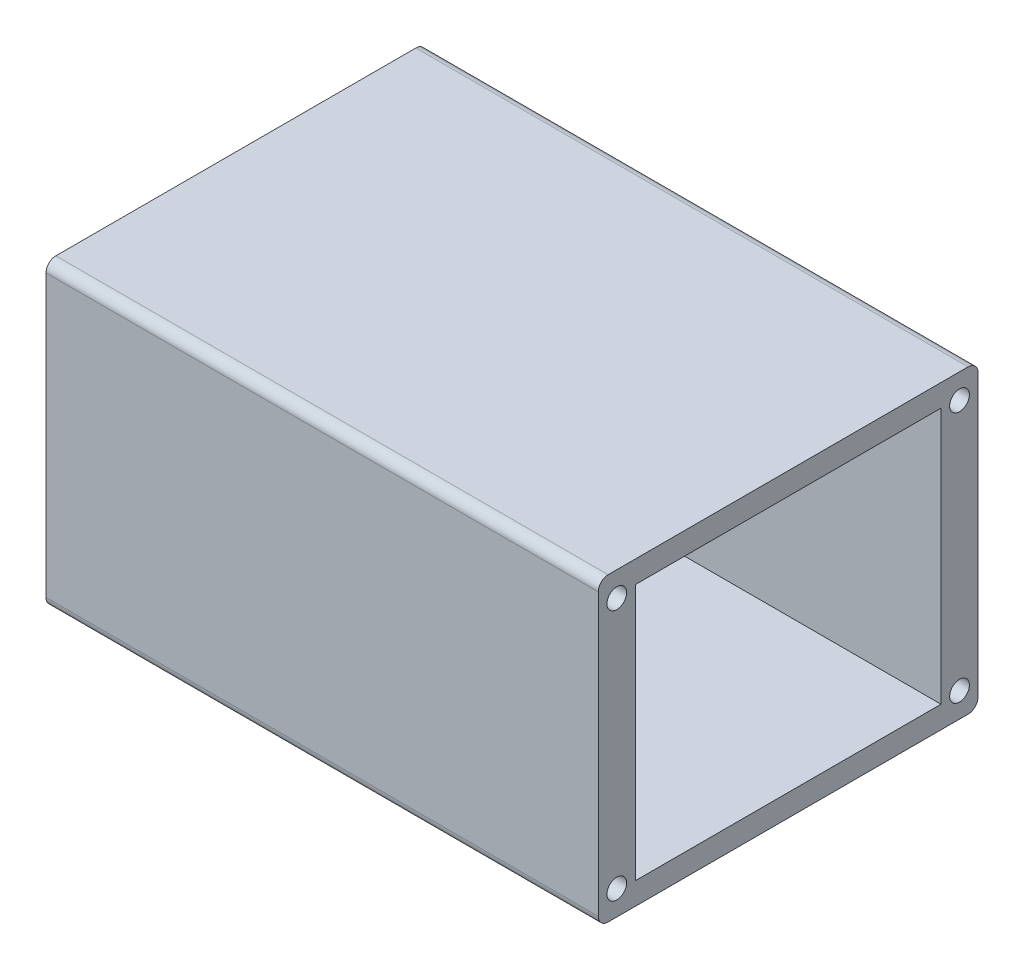
ISO-10303-21;
HEADER;
FILE_DESCRIPTION(('STEP AP214'),'2;1');
FILE_NAME('part.step','',(''),(''),'','','');
FILE_SCHEMA(('AUTOMOTIVE_DESIGN { 1 0 10303 214 1 1 1 1 }'));
ENDSEC;
DATA;
#1=APPLICATION_CONTEXT('core data for automotive mechanical design processes');
#2=APPLICATION_PROTOCOL_DEFINITION('international standard','automotive_design',2000,#1);
#3=PRODUCT_CONTEXT('',#1,'mechanical');
#4=PRODUCT('Part','Part','',(#3));
#5=PRODUCT_RELATED_PRODUCT_CATEGORY('part','',(#4));
#6=PRODUCT_DEFINITION_FORMATION('','',#4);
#7=PRODUCT_DEFINITION_CONTEXT('part definition',#1,'design');
#8=PRODUCT_DEFINITION('design','',#6,#7);
#9=PRODUCT_DEFINITION_SHAPE('','',#8);
#10=(LENGTH_UNIT() NAMED_UNIT(*) SI_UNIT(.MILLI.,.METRE.));
#11=(NAMED_UNIT(*) PLANE_ANGLE_UNIT() SI_UNIT($,.RADIAN.));
#12=(NAMED_UNIT(*) SI_UNIT($,.STERADIAN.) SOLID_ANGLE_UNIT());
#13=UNCERTAINTY_MEASURE_WITH_UNIT(LENGTH_MEASURE(1.E-05),#10,'distance_accuracy_value','');
#14=(GEOMETRIC_REPRESENTATION_CONTEXT(3) GLOBAL_UNCERTAINTY_ASSIGNED_CONTEXT((#13)) GLOBAL_UNIT_ASSIGNED_CONTEXT((#10,
#11,#12)) REPRESENTATION_CONTEXT('',''));
#15=CARTESIAN_POINT('',(0.,0.,0.));
#16=DIRECTION('',(0.,0.,1.));
#17=DIRECTION('',(1.,0.,0.));
#18=AXIS2_PLACEMENT_3D('',#15,#16,#17);
#19=CARTESIAN_POINT('',(112.,30.5,-38.5));
#20=DIRECTION('',(0.,0.,1.));
#21=DIRECTION('',(0.,-1.,0.));
#22=AXIS2_PLACEMENT_3D('',#19,#20,#21);
#23=PLANE('',#22);
#24=DIRECTION('',(0.,1.,0.));
#25=VECTOR('',#24,1.);
#26=CARTESIAN_POINT('',(112.,30.5,-38.5));
#27=LINE('',#26,#25);
#28=CARTESIAN_POINT('',(112.,-28.5,-38.5));
#29=VERTEX_POINT('',#28);
#30=CARTESIAN_POINT('',(112.,28.5,-38.5));
#31=VERTEX_POINT('',#30);
#32=EDGE_CURVE('E175',#29,#31,#27,.T.);
#33=ORIENTED_EDGE('',*,*,#32,.F.);
#34=DIRECTION('',(-1.,0.,0.));
#35=VECTOR('',#34,1.);
#36=CARTESIAN_POINT('',(112.,-28.5,-38.5));
#37=LINE('',#36,#35);
#38=CARTESIAN_POINT('',(0.,-28.5,-38.5));
#39=VERTEX_POINT('',#38);
#40=EDGE_CURVE('E45',#29,#39,#37,.T.);
#41=ORIENTED_EDGE('',*,*,#40,.T.);
#42=DIRECTION('',(0.,1.,0.));
#43=VECTOR('',#42,1.);
#44=CARTESIAN_POINT('',(0.,30.5,-38.5));
#45=LINE('',#44,#43);
#46=CARTESIAN_POINT('',(0.,28.5,-38.5));
#47=VERTEX_POINT('',#46);
#48=EDGE_CURVE('E171',#39,#47,#45,.T.);
#49=ORIENTED_EDGE('',*,*,#48,.T.);
#50=DIRECTION('',(-1.,0.,0.));
#51=VECTOR('',#50,1.);
#52=CARTESIAN_POINT('',(112.,28.5,-38.5));
#53=LINE('',#52,#51);
#54=EDGE_CURVE('E52',#47,#31,#53,.F.);
#55=ORIENTED_EDGE('',*,*,#54,.T.);
#56=EDGE_LOOP('',(#33,#41,#49,#55));
#57=FACE_BOUND('',#56,.T.);
#58=ADVANCED_FACE('F37',(#57),#23,.F.);
#59=CARTESIAN_POINT('',(112.,30.5,38.5));
#60=DIRECTION('',(0.,-1.,0.));
#61=DIRECTION('',(0.,0.,-1.));
#62=AXIS2_PLACEMENT_3D('',#59,#60,#61);
#63=PLANE('',#62);
#64=DIRECTION('',(0.,0.,1.));
#65=VECTOR('',#64,1.);
#66=CARTESIAN_POINT('',(112.,30.5,38.5));
#67=LINE('',#66,#65);
#68=CARTESIAN_POINT('',(112.,30.5,-36.5));
#69=VERTEX_POINT('',#68);
#70=CARTESIAN_POINT('',(112.,30.5,36.5));
#71=VERTEX_POINT('',#70);
#72=EDGE_CURVE('E177',#69,#71,#67,.T.);
#73=ORIENTED_EDGE('',*,*,#72,.F.);
#74=DIRECTION('',(-1.,0.,0.));
#75=VECTOR('',#74,1.);
#76=CARTESIAN_POINT('',(112.,30.5,-36.5));
#77=LINE('',#76,#75);
#78=CARTESIAN_POINT('',(0.,30.5,-36.5));
#79=VERTEX_POINT('',#78);
#80=EDGE_CURVE('E11',#69,#79,#77,.T.);
#81=ORIENTED_EDGE('',*,*,#80,.T.);
#82=DIRECTION('',(0.,0.,1.));
#83=VECTOR('',#82,1.);
#84=CARTESIAN_POINT('',(0.,30.5,38.5));
#85=LINE('',#84,#83);
#86=CARTESIAN_POINT('',(0.,30.5,36.5));
#87=VERTEX_POINT('',#86);
#88=EDGE_CURVE('E187',#79,#87,#85,.T.);
#89=ORIENTED_EDGE('',*,*,#88,.T.);
#90=DIRECTION('',(-1.,0.,0.));
#91=VECTOR('',#90,1.);
#92=CARTESIAN_POINT('',(112.,30.5,36.5));
#93=LINE('',#92,#91);
#94=EDGE_CURVE('E199',#87,#71,#93,.F.);
#95=ORIENTED_EDGE('',*,*,#94,.T.);
#96=EDGE_LOOP('',(#73,#81,#89,#95));
#97=FACE_BOUND('',#96,.T.);
#98=ADVANCED_FACE('F235',(#97),#63,.F.);
#99=CARTESIAN_POINT('',(112.,30.5,38.5));
#100=DIRECTION('',(0.,0.,-1.));
#101=DIRECTION('',(0.,1.,0.));
#102=AXIS2_PLACEMENT_3D('',#99,#100,#101);
#103=PLANE('',#102);
#104=DIRECTION('',(0.,-1.,0.));
#105=VECTOR('',#104,1.);
#106=CARTESIAN_POINT('',(0.,30.5,38.5));
#107=LINE('',#106,#105);
#108=CARTESIAN_POINT('',(0.,28.5,38.5));
#109=VERTEX_POINT('',#108);
#110=CARTESIAN_POINT('',(0.,-28.5,38.5));
#111=VERTEX_POINT('',#110);
#112=EDGE_CURVE('E189',#109,#111,#107,.T.);
#113=ORIENTED_EDGE('',*,*,#112,.T.);
#114=DIRECTION('',(-1.,0.,0.));
#115=VECTOR('',#114,1.);
#116=CARTESIAN_POINT('',(112.,-28.5,38.5));
#117=LINE('',#116,#115);
#118=CARTESIAN_POINT('',(112.,-28.5,38.5));
#119=VERTEX_POINT('',#118);
#120=EDGE_CURVE('E215',#111,#119,#117,.F.);
#121=ORIENTED_EDGE('',*,*,#120,.T.);
#122=DIRECTION('',(0.,-1.,0.));
#123=VECTOR('',#122,1.);
#124=CARTESIAN_POINT('',(112.,30.5,38.5));
#125=LINE('',#124,#123);
#126=CARTESIAN_POINT('',(112.,28.5,38.5));
#127=VERTEX_POINT('',#126);
#128=EDGE_CURVE('E180',#127,#119,#125,.T.);
#129=ORIENTED_EDGE('',*,*,#128,.F.);
#130=DIRECTION('',(-1.,0.,0.));
#131=VECTOR('',#130,1.);
#132=CARTESIAN_POINT('',(112.,28.5,38.5));
#133=LINE('',#132,#131);
#134=EDGE_CURVE('E185',#127,#109,#133,.T.);
#135=ORIENTED_EDGE('',*,*,#134,.T.);
#136=EDGE_LOOP('',(#113,#121,#129,#135));
#137=FACE_BOUND('',#136,.T.);
#138=ADVANCED_FACE('F244',(#137),#103,.F.);
#139=CARTESIAN_POINT('',(112.,-30.5,38.5));
#140=DIRECTION('',(0.,1.,0.));
#141=DIRECTION('',(0.,0.,1.));
#142=AXIS2_PLACEMENT_3D('',#139,#140,#141);
#143=PLANE('',#142);
#144=DIRECTION('',(0.,0.,-1.));
#145=VECTOR('',#144,1.);
#146=CARTESIAN_POINT('',(112.,-30.5,38.5));
#147=LINE('',#146,#145);
#148=CARTESIAN_POINT('',(112.,-30.5,36.5));
#149=VERTEX_POINT('',#148);
#150=CARTESIAN_POINT('',(112.,-30.5,-36.5));
#151=VERTEX_POINT('',#150);
#152=EDGE_CURVE('E183',#149,#151,#147,.T.);
#153=ORIENTED_EDGE('',*,*,#152,.F.);
#154=DIRECTION('',(-1.,0.,0.));
#155=VECTOR('',#154,1.);
#156=CARTESIAN_POINT('',(112.,-30.5,36.5));
#157=LINE('',#156,#155);
#158=CARTESIAN_POINT('',(0.,-30.5,36.5));
#159=VERTEX_POINT('',#158);
#160=EDGE_CURVE('E206',#149,#159,#157,.T.);
#161=ORIENTED_EDGE('',*,*,#160,.T.);
#162=DIRECTION('',(0.,0.,-1.));
#163=VECTOR('',#162,1.);
#164=CARTESIAN_POINT('',(0.,-30.5,38.5));
#165=LINE('',#164,#163);
#166=CARTESIAN_POINT('',(0.,-30.5,-36.5));
#167=VERTEX_POINT('',#166);
#168=EDGE_CURVE('E178',#159,#167,#165,.T.);
#169=ORIENTED_EDGE('',*,*,#168,.T.);
#170=DIRECTION('',(-1.,0.,0.));
#171=VECTOR('',#170,1.);
#172=CARTESIAN_POINT('',(112.,-30.5,-36.5));
#173=LINE('',#172,#171);
#174=EDGE_CURVE('E204',#167,#151,#173,.F.);
#175=ORIENTED_EDGE('',*,*,#174,.T.);
#176=EDGE_LOOP('',(#153,#161,#169,#175));
#177=FACE_BOUND('',#176,.T.);
#178=ADVANCED_FACE('F253',(#177),#143,.F.);
#179=CARTESIAN_POINT('',(112.,0.,0.));
#180=DIRECTION('',(1.,0.,0.));
#181=DIRECTION('',(0.,0.,-1.));
#182=AXIS2_PLACEMENT_3D('',#179,#180,#181);
#183=PLANE('',#182);
#184=CARTESIAN_POINT('',(112.,-25.5,34.75));
#185=DIRECTION('',(1.,0.,0.));
#186=DIRECTION('',(0.,0.,-1.));
#187=AXIS2_PLACEMENT_3D('',#184,#185,#186);
#188=CIRCLE('',#187,2.);
#189=CARTESIAN_POINT('',(112.,-25.5,32.75));
#190=VERTEX_POINT('',#189);
#191=EDGE_CURVE('E474',#190,#190,#188,.T.);
#192=ORIENTED_EDGE('',*,*,#191,.F.);
#193=EDGE_LOOP('',(#192));
#194=FACE_BOUND('',#193,.T.);
#195=CARTESIAN_POINT('',(112.,25.5,-34.75));
#196=DIRECTION('',(1.,0.,0.));
#197=DIRECTION('',(0.,0.,-1.));
#198=AXIS2_PLACEMENT_3D('',#195,#196,#197);
#199=CIRCLE('',#198,2.);
#200=CARTESIAN_POINT('',(112.,25.5,-36.75));
#201=VERTEX_POINT('',#200);
#202=EDGE_CURVE('E463',#201,#201,#199,.T.);
#203=ORIENTED_EDGE('',*,*,#202,.F.);
#204=EDGE_LOOP('',(#203));
#205=FACE_BOUND('',#204,.T.);
#206=CARTESIAN_POINT('',(112.,-25.5,-34.75));
#207=DIRECTION('',(1.,0.,0.));
#208=DIRECTION('',(0.,0.,-1.));
#209=AXIS2_PLACEMENT_3D('',#206,#207,#208);
#210=CIRCLE('',#209,2.);
#211=CARTESIAN_POINT('',(112.,-25.5,-36.75));
#212=VERTEX_POINT('',#211);
#213=EDGE_CURVE('E464',#212,#212,#210,.T.);
#214=ORIENTED_EDGE('',*,*,#213,.F.);
#215=EDGE_LOOP('',(#214));
#216=FACE_BOUND('',#215,.T.);
#217=CARTESIAN_POINT('',(112.,25.5,34.75));
#218=DIRECTION('',(1.,0.,0.));
#219=DIRECTION('',(0.,0.,-1.));
#220=AXIS2_PLACEMENT_3D('',#217,#218,#219);
#221=CIRCLE('',#220,2.);
#222=CARTESIAN_POINT('',(112.,25.5,32.75));
#223=VERTEX_POINT('',#222);
#224=EDGE_CURVE('E158',#223,#223,#221,.T.);
#225=ORIENTED_EDGE('',*,*,#224,.F.);
#226=EDGE_LOOP('',(#225));
#227=FACE_BOUND('',#226,.T.);
#228=DIRECTION('',(0.,1.,0.));
#229=VECTOR('',#228,1.);
#230=CARTESIAN_POINT('',(112.,26.,-31.));
#231=LINE('',#230,#229);
#232=CARTESIAN_POINT('',(112.,-26.,-31.));
#233=VERTEX_POINT('',#232);
#234=CARTESIAN_POINT('',(112.,26.,-31.));
#235=VERTEX_POINT('',#234);
#236=EDGE_CURVE('E135',#233,#235,#231,.T.);
#237=ORIENTED_EDGE('',*,*,#236,.F.);
#238=DIRECTION('',(0.,0.,-1.));
#239=VECTOR('',#238,1.);
#240=CARTESIAN_POINT('',(112.,-26.,31.));
#241=LINE('',#240,#239);
#242=CARTESIAN_POINT('',(112.,-26.,31.));
#243=VERTEX_POINT('',#242);
#244=EDGE_CURVE('E152',#243,#233,#241,.T.);
#245=ORIENTED_EDGE('',*,*,#244,.F.);
#246=DIRECTION('',(0.,-1.,0.));
#247=VECTOR('',#246,1.);
#248=CARTESIAN_POINT('',(112.,26.,31.));
#249=LINE('',#248,#247);
#250=CARTESIAN_POINT('',(112.,26.,31.));
#251=VERTEX_POINT('',#250);
#252=EDGE_CURVE('E155',#251,#243,#249,.T.);
#253=ORIENTED_EDGE('',*,*,#252,.F.);
#254=DIRECTION('',(0.,0.,1.));
#255=VECTOR('',#254,1.);
#256=CARTESIAN_POINT('',(112.,26.,31.));
#257=LINE('',#256,#255);
#258=EDGE_CURVE('E164',#235,#251,#257,.T.);
#259=ORIENTED_EDGE('',*,*,#258,.F.);
#260=EDGE_LOOP('',(#237,#245,#253,#259));
#261=FACE_BOUND('',#260,.T.);
#262=ORIENTED_EDGE('',*,*,#128,.T.);
#263=CARTESIAN_POINT('',(112.,-28.5,36.5));
#264=DIRECTION('',(1.,0.,0.));
#265=DIRECTION('',(0.,0.,-1.));
#266=AXIS2_PLACEMENT_3D('',#263,#264,#265);
#267=CIRCLE('',#266,2.);
#268=EDGE_CURVE('E220',#119,#149,#267,.T.);
#269=ORIENTED_EDGE('',*,*,#268,.T.);
#270=ORIENTED_EDGE('',*,*,#152,.T.);
#271=CARTESIAN_POINT('',(112.,-28.5,-36.5));
#272=DIRECTION('',(1.,0.,0.));
#273=DIRECTION('',(0.,0.,-1.));
#274=AXIS2_PLACEMENT_3D('',#271,#272,#273);
#275=CIRCLE('',#274,2.);
#276=EDGE_CURVE('E59',#151,#29,#275,.T.);
#277=ORIENTED_EDGE('',*,*,#276,.T.);
#278=ORIENTED_EDGE('',*,*,#32,.T.);
#279=CARTESIAN_POINT('',(112.,28.5,-36.5));
#280=DIRECTION('',(1.,0.,0.));
#281=DIRECTION('',(0.,0.,-1.));
#282=AXIS2_PLACEMENT_3D('',#279,#280,#281);
#283=CIRCLE('',#282,2.);
#284=EDGE_CURVE('E217',#31,#69,#283,.T.);
#285=ORIENTED_EDGE('',*,*,#284,.T.);
#286=ORIENTED_EDGE('',*,*,#72,.T.);
#287=CARTESIAN_POINT('',(112.,28.5,36.5));
#288=DIRECTION('',(1.,0.,0.));
#289=DIRECTION('',(0.,0.,-1.));
#290=AXIS2_PLACEMENT_3D('',#287,#288,#289);
#291=CIRCLE('',#290,2.);
#292=EDGE_CURVE('E202',#71,#127,#291,.T.);
#293=ORIENTED_EDGE('',*,*,#292,.T.);
#294=EDGE_LOOP('',(#262,#269,#270,#277,#278,#285,#286,#293));
#295=FACE_BOUND('',#294,.T.);
#296=ADVANCED_FACE('F238',(#194,#205,#216,#227,#261,#295),#183,.T.);
#297=CARTESIAN_POINT('',(0.,0.,0.));
#298=DIRECTION('',(1.,0.,0.));
#299=DIRECTION('',(0.,0.,-1.));
#300=AXIS2_PLACEMENT_3D('',#297,#298,#299);
#301=PLANE('',#300);
#302=ORIENTED_EDGE('',*,*,#168,.F.);
#303=CARTESIAN_POINT('',(0.,-28.5,36.5));
#304=DIRECTION('',(1.,0.,0.));
#305=DIRECTION('',(0.,0.,-1.));
#306=AXIS2_PLACEMENT_3D('',#303,#304,#305);
#307=CIRCLE('',#306,2.);
#308=EDGE_CURVE('E213',#159,#111,#307,.F.);
#309=ORIENTED_EDGE('',*,*,#308,.T.);
#310=ORIENTED_EDGE('',*,*,#112,.F.);
#311=CARTESIAN_POINT('',(0.,28.5,36.5));
#312=DIRECTION('',(1.,0.,0.));
#313=DIRECTION('',(0.,0.,-1.));
#314=AXIS2_PLACEMENT_3D('',#311,#312,#313);
#315=CIRCLE('',#314,2.);
#316=EDGE_CURVE('E196',#109,#87,#315,.F.);
#317=ORIENTED_EDGE('',*,*,#316,.T.);
#318=ORIENTED_EDGE('',*,*,#88,.F.);
#319=CARTESIAN_POINT('',(0.,28.5,-36.5));
#320=DIRECTION('',(1.,0.,0.));
#321=DIRECTION('',(0.,0.,-1.));
#322=AXIS2_PLACEMENT_3D('',#319,#320,#321);
#323=CIRCLE('',#322,2.);
#324=EDGE_CURVE('E209',#79,#47,#323,.F.);
#325=ORIENTED_EDGE('',*,*,#324,.T.);
#326=ORIENTED_EDGE('',*,*,#48,.F.);
#327=CARTESIAN_POINT('',(0.,-28.5,-36.5));
#328=DIRECTION('',(1.,0.,0.));
#329=DIRECTION('',(0.,0.,-1.));
#330=AXIS2_PLACEMENT_3D('',#327,#328,#329);
#331=CIRCLE('',#330,2.);
#332=EDGE_CURVE('E211',#39,#167,#331,.F.);
#333=ORIENTED_EDGE('',*,*,#332,.T.);
#334=EDGE_LOOP('',(#302,#309,#310,#317,#318,#325,#326,#333));
#335=FACE_BOUND('',#334,.T.);
#336=ADVANCED_FACE('F228',(#335),#301,.F.);
#337=CARTESIAN_POINT('',(2.00000000000002,26.,-31.));
#338=DIRECTION('',(0.,0.,-1.));
#339=DIRECTION('',(0.,1.,0.));
#340=AXIS2_PLACEMENT_3D('',#337,#338,#339);
#341=PLANE('',#340);
#342=ORIENTED_EDGE('',*,*,#236,.T.);
#343=DIRECTION('',(1.,0.,0.));
#344=VECTOR('',#343,1.);
#345=CARTESIAN_POINT('',(2.00000000000002,26.,-31.));
#346=LINE('',#345,#344);
#347=CARTESIAN_POINT('',(2.00000000000002,26.,-31.));
#348=VERTEX_POINT('',#347);
#349=EDGE_CURVE('E128',#348,#235,#346,.T.);
#350=ORIENTED_EDGE('',*,*,#349,.F.);
#351=DIRECTION('',(0.,1.,0.));
#352=VECTOR('',#351,1.);
#353=CARTESIAN_POINT('',(2.00000000000002,26.,-31.));
#354=LINE('',#353,#352);
#355=CARTESIAN_POINT('',(2.00000000000002,-26.,-31.));
#356=VERTEX_POINT('',#355);
#357=EDGE_CURVE('E132',#356,#348,#354,.T.);
#358=ORIENTED_EDGE('',*,*,#357,.F.);
#359=DIRECTION('',(1.,0.,0.));
#360=VECTOR('',#359,1.);
#361=CARTESIAN_POINT('',(2.00000000000002,-26.,-31.));
#362=LINE('',#361,#360);
#363=EDGE_CURVE('E169',#356,#233,#362,.T.);
#364=ORIENTED_EDGE('',*,*,#363,.T.);
#365=EDGE_LOOP('',(#342,#350,#358,#364));
#366=FACE_BOUND('',#365,.T.);
#367=ADVANCED_FACE('F130',(#366),#341,.F.);
#368=CARTESIAN_POINT('',(2.00000000000002,-26.,31.));
#369=DIRECTION('',(0.,-1.,0.));
#370=DIRECTION('',(0.,0.,-1.));
#371=AXIS2_PLACEMENT_3D('',#368,#369,#370);
#372=PLANE('',#371);
#373=ORIENTED_EDGE('',*,*,#244,.T.);
#374=ORIENTED_EDGE('',*,*,#363,.F.);
#375=DIRECTION('',(0.,0.,-1.));
#376=VECTOR('',#375,1.);
#377=CARTESIAN_POINT('',(2.00000000000002,-26.,31.));
#378=LINE('',#377,#376);
#379=CARTESIAN_POINT('',(2.00000000000002,-26.,31.));
#380=VERTEX_POINT('',#379);
#381=EDGE_CURVE('E140',#380,#356,#378,.T.);
#382=ORIENTED_EDGE('',*,*,#381,.F.);
#383=DIRECTION('',(1.,0.,0.));
#384=VECTOR('',#383,1.);
#385=CARTESIAN_POINT('',(2.00000000000002,-26.,31.));
#386=LINE('',#385,#384);
#387=EDGE_CURVE('E172',#380,#243,#386,.T.);
#388=ORIENTED_EDGE('',*,*,#387,.T.);
#389=EDGE_LOOP('',(#373,#374,#382,#388));
#390=FACE_BOUND('',#389,.T.);
#391=ADVANCED_FACE('F307',(#390),#372,.F.);
#392=CARTESIAN_POINT('',(2.00000000000002,26.,31.));
#393=DIRECTION('',(0.,0.,1.));
#394=DIRECTION('',(0.,-1.,0.));
#395=AXIS2_PLACEMENT_3D('',#392,#393,#394);
#396=PLANE('',#395);
#397=ORIENTED_EDGE('',*,*,#252,.T.);
#398=ORIENTED_EDGE('',*,*,#387,.F.);
#399=DIRECTION('',(0.,-1.,0.));
#400=VECTOR('',#399,1.);
#401=CARTESIAN_POINT('',(2.00000000000002,26.,31.));
#402=LINE('',#401,#400);
#403=CARTESIAN_POINT('',(2.00000000000002,26.,31.));
#404=VERTEX_POINT('',#403);
#405=EDGE_CURVE('E148',#404,#380,#402,.T.);
#406=ORIENTED_EDGE('',*,*,#405,.F.);
#407=DIRECTION('',(1.,0.,0.));
#408=VECTOR('',#407,1.);
#409=CARTESIAN_POINT('',(2.00000000000002,26.,31.));
#410=LINE('',#409,#408);
#411=EDGE_CURVE('E139',#404,#251,#410,.T.);
#412=ORIENTED_EDGE('',*,*,#411,.T.);
#413=EDGE_LOOP('',(#397,#398,#406,#412));
#414=FACE_BOUND('',#413,.T.);
#415=ADVANCED_FACE('F310',(#414),#396,.F.);
#416=CARTESIAN_POINT('',(2.00000000000002,26.,31.));
#417=DIRECTION('',(0.,1.,0.));
#418=DIRECTION('',(0.,0.,1.));
#419=AXIS2_PLACEMENT_3D('',#416,#417,#418);
#420=PLANE('',#419);
#421=ORIENTED_EDGE('',*,*,#258,.T.);
#422=ORIENTED_EDGE('',*,*,#411,.F.);
#423=DIRECTION('',(0.,0.,1.));
#424=VECTOR('',#423,1.);
#425=CARTESIAN_POINT('',(2.00000000000002,26.,31.));
#426=LINE('',#425,#424);
#427=EDGE_CURVE('E143',#348,#404,#426,.T.);
#428=ORIENTED_EDGE('',*,*,#427,.F.);
#429=ORIENTED_EDGE('',*,*,#349,.T.);
#430=EDGE_LOOP('',(#421,#422,#428,#429));
#431=FACE_BOUND('',#430,.T.);
#432=ADVANCED_FACE('F144',(#431),#420,.F.);
#433=CARTESIAN_POINT('',(2.00000000000002,0.,0.));
#434=DIRECTION('',(1.,0.,0.));
#435=DIRECTION('',(0.,0.,-1.));
#436=AXIS2_PLACEMENT_3D('',#433,#434,#435);
#437=PLANE('',#436);
#438=ORIENTED_EDGE('',*,*,#357,.T.);
#439=ORIENTED_EDGE('',*,*,#427,.T.);
#440=ORIENTED_EDGE('',*,*,#405,.T.);
#441=ORIENTED_EDGE('',*,*,#381,.T.);
#442=EDGE_LOOP('',(#438,#439,#440,#441));
#443=FACE_BOUND('',#442,.T.);
#444=ADVANCED_FACE('F150',(#443),#437,.T.);
#445=CARTESIAN_POINT('',(97.,25.5,34.75));
#446=DIRECTION('',(1.,0.,0.));
#447=DIRECTION('',(0.,0.,-1.));
#448=AXIS2_PLACEMENT_3D('',#445,#446,#447);
#449=CYLINDRICAL_SURFACE('',#448,2.);
#450=CARTESIAN_POINT('',(97.,25.5,34.75));
#451=DIRECTION('',(1.,0.,0.));
#452=DIRECTION('',(0.,0.,-1.));
#453=AXIS2_PLACEMENT_3D('',#450,#451,#452);
#454=CIRCLE('',#453,2.);
#455=CARTESIAN_POINT('',(97.,25.5,32.75));
#456=VERTEX_POINT('',#455);
#457=EDGE_CURVE('E165',#456,#456,#454,.T.);
#458=ORIENTED_EDGE('',*,*,#457,.F.);
#459=EDGE_LOOP('',(#458));
#460=FACE_BOUND('',#459,.T.);
#461=ORIENTED_EDGE('',*,*,#224,.T.);
#462=EDGE_LOOP('',(#461));
#463=FACE_BOUND('',#462,.T.);
#464=ADVANCED_FACE('F300',(#460,#463),#449,.F.);
#465=CARTESIAN_POINT('',(97.,25.5,34.75));
#466=DIRECTION('',(1.,0.,0.));
#467=DIRECTION('',(0.,0.,-1.));
#468=AXIS2_PLACEMENT_3D('',#465,#466,#467);
#469=PLANE('',#468);
#470=ORIENTED_EDGE('',*,*,#457,.T.);
#471=EDGE_LOOP('',(#470));
#472=FACE_BOUND('',#471,.T.);
#473=ADVANCED_FACE('F297',(#472),#469,.T.);
#474=CARTESIAN_POINT('',(97.,-25.5,-34.75));
#475=DIRECTION('',(1.,0.,0.));
#476=DIRECTION('',(0.,0.,-1.));
#477=AXIS2_PLACEMENT_3D('',#474,#475,#476);
#478=CYLINDRICAL_SURFACE('',#477,2.);
#479=CARTESIAN_POINT('',(97.,-25.5,-34.75));
#480=DIRECTION('',(1.,0.,0.));
#481=DIRECTION('',(0.,0.,-1.));
#482=AXIS2_PLACEMENT_3D('',#479,#480,#481);
#483=CIRCLE('',#482,2.);
#484=CARTESIAN_POINT('',(97.,-25.5,-36.75));
#485=VERTEX_POINT('',#484);
#486=EDGE_CURVE('E462',#485,#485,#483,.T.);
#487=ORIENTED_EDGE('',*,*,#486,.F.);
#488=EDGE_LOOP('',(#487));
#489=FACE_BOUND('',#488,.T.);
#490=ORIENTED_EDGE('',*,*,#213,.T.);
#491=EDGE_LOOP('',(#490));
#492=FACE_BOUND('',#491,.T.);
#493=ADVANCED_FACE('F286',(#489,#492),#478,.F.);
#494=CARTESIAN_POINT('',(97.,-25.5,-34.75));
#495=DIRECTION('',(1.,0.,0.));
#496=DIRECTION('',(0.,0.,-1.));
#497=AXIS2_PLACEMENT_3D('',#494,#495,#496);
#498=PLANE('',#497);
#499=ORIENTED_EDGE('',*,*,#486,.T.);
#500=EDGE_LOOP('',(#499));
#501=FACE_BOUND('',#500,.T.);
#502=ADVANCED_FACE('F295',(#501),#498,.T.);
#503=CARTESIAN_POINT('',(97.,25.5,-34.75));
#504=DIRECTION('',(1.,0.,0.));
#505=DIRECTION('',(0.,0.,-1.));
#506=AXIS2_PLACEMENT_3D('',#503,#504,#505);
#507=CYLINDRICAL_SURFACE('',#506,2.);
#508=CARTESIAN_POINT('',(97.,25.5,-34.75));
#509=DIRECTION('',(1.,0.,0.));
#510=DIRECTION('',(0.,0.,-1.));
#511=AXIS2_PLACEMENT_3D('',#508,#509,#510);
#512=CIRCLE('',#511,2.);
#513=CARTESIAN_POINT('',(97.,25.5,-36.75));
#514=VERTEX_POINT('',#513);
#515=EDGE_CURVE('E467',#514,#514,#512,.T.);
#516=ORIENTED_EDGE('',*,*,#515,.F.);
#517=EDGE_LOOP('',(#516));
#518=FACE_BOUND('',#517,.T.);
#519=ORIENTED_EDGE('',*,*,#202,.T.);
#520=EDGE_LOOP('',(#519));
#521=FACE_BOUND('',#520,.T.);
#522=ADVANCED_FACE('F291',(#518,#521),#507,.F.);
#523=CARTESIAN_POINT('',(97.,25.5,-34.75));
#524=DIRECTION('',(1.,0.,0.));
#525=DIRECTION('',(0.,0.,-1.));
#526=AXIS2_PLACEMENT_3D('',#523,#524,#525);
#527=PLANE('',#526);
#528=ORIENTED_EDGE('',*,*,#515,.T.);
#529=EDGE_LOOP('',(#528));
#530=FACE_BOUND('',#529,.T.);
#531=ADVANCED_FACE('F281',(#530),#527,.T.);
#532=CARTESIAN_POINT('',(97.,-25.5,34.75));
#533=DIRECTION('',(1.,0.,0.));
#534=DIRECTION('',(0.,0.,-1.));
#535=AXIS2_PLACEMENT_3D('',#532,#533,#534);
#536=CYLINDRICAL_SURFACE('',#535,2.);
#537=CARTESIAN_POINT('',(97.,-25.5,34.75));
#538=DIRECTION('',(1.,0.,0.));
#539=DIRECTION('',(0.,0.,-1.));
#540=AXIS2_PLACEMENT_3D('',#537,#538,#539);
#541=CIRCLE('',#540,2.);
#542=CARTESIAN_POINT('',(97.,-25.5,32.75));
#543=VERTEX_POINT('',#542);
#544=EDGE_CURVE('E472',#543,#543,#541,.T.);
#545=ORIENTED_EDGE('',*,*,#544,.F.);
#546=EDGE_LOOP('',(#545));
#547=FACE_BOUND('',#546,.T.);
#548=ORIENTED_EDGE('',*,*,#191,.T.);
#549=EDGE_LOOP('',(#548));
#550=FACE_BOUND('',#549,.T.);
#551=ADVANCED_FACE('F275',(#547,#550),#536,.F.);
#552=CARTESIAN_POINT('',(97.,-25.5,34.75));
#553=DIRECTION('',(1.,0.,0.));
#554=DIRECTION('',(0.,0.,-1.));
#555=AXIS2_PLACEMENT_3D('',#552,#553,#554);
#556=PLANE('',#555);
#557=ORIENTED_EDGE('',*,*,#544,.T.);
#558=EDGE_LOOP('',(#557));
#559=FACE_BOUND('',#558,.T.);
#560=ADVANCED_FACE('F271',(#559),#556,.T.);
#561=CARTESIAN_POINT('',(112.,28.5,36.5));
#562=DIRECTION('',(-1.,0.,0.));
#563=DIRECTION('',(0.,0.,1.));
#564=AXIS2_PLACEMENT_3D('',#561,#562,#563);
#565=CYLINDRICAL_SURFACE('',#564,2.);
#566=ORIENTED_EDGE('',*,*,#292,.F.);
#567=ORIENTED_EDGE('',*,*,#94,.F.);
#568=ORIENTED_EDGE('',*,*,#316,.F.);
#569=ORIENTED_EDGE('',*,*,#134,.F.);
#570=EDGE_LOOP('',(#566,#567,#568,#569));
#571=FACE_BOUND('',#570,.T.);
#572=ADVANCED_FACE('F247',(#571),#565,.T.);
#573=CARTESIAN_POINT('',(112.,-28.5,36.5));
#574=DIRECTION('',(-1.,0.,0.));
#575=DIRECTION('',(0.,0.,1.));
#576=AXIS2_PLACEMENT_3D('',#573,#574,#575);
#577=CYLINDRICAL_SURFACE('',#576,2.);
#578=ORIENTED_EDGE('',*,*,#268,.F.);
#579=ORIENTED_EDGE('',*,*,#120,.F.);
#580=ORIENTED_EDGE('',*,*,#308,.F.);
#581=ORIENTED_EDGE('',*,*,#160,.F.);
#582=EDGE_LOOP('',(#578,#579,#580,#581));
#583=FACE_BOUND('',#582,.T.);
#584=ADVANCED_FACE('F249',(#583),#577,.T.);
#585=CARTESIAN_POINT('',(112.,-28.5,-36.5));
#586=DIRECTION('',(-1.,0.,0.));
#587=DIRECTION('',(0.,0.,1.));
#588=AXIS2_PLACEMENT_3D('',#585,#586,#587);
#589=CYLINDRICAL_SURFACE('',#588,2.);
#590=ORIENTED_EDGE('',*,*,#276,.F.);
#591=ORIENTED_EDGE('',*,*,#174,.F.);
#592=ORIENTED_EDGE('',*,*,#332,.F.);
#593=ORIENTED_EDGE('',*,*,#40,.F.);
#594=EDGE_LOOP('',(#590,#591,#592,#593));
#595=FACE_BOUND('',#594,.T.);
#596=ADVANCED_FACE('F255',(#595),#589,.T.);
#597=CARTESIAN_POINT('',(112.,28.5,-36.5));
#598=DIRECTION('',(-1.,0.,0.));
#599=DIRECTION('',(0.,0.,1.));
#600=AXIS2_PLACEMENT_3D('',#597,#598,#599);
#601=CYLINDRICAL_SURFACE('',#600,2.);
#602=ORIENTED_EDGE('',*,*,#284,.F.);
#603=ORIENTED_EDGE('',*,*,#54,.F.);
#604=ORIENTED_EDGE('',*,*,#324,.F.);
#605=ORIENTED_EDGE('',*,*,#80,.F.);
#606=EDGE_LOOP('',(#602,#603,#604,#605));
#607=FACE_BOUND('',#606,.T.);
#608=ADVANCED_FACE('F39',(#607),#601,.T.);
#609=CLOSED_SHELL('',(#58,#98,#138,#178,#296,#336,#367,#391,#415,#432,#444,#464,#473,#493,#502,
#522,#531,#551,#560,#572,#584,#596,#608));
#610=MANIFOLD_SOLID_BREP('B2',#609);
#611=ADVANCED_BREP_SHAPE_REPRESENTATION('',(#18,#610),#14);
#612=SHAPE_DEFINITION_REPRESENTATION(#9,#611);
ENDSEC;
END-ISO-10303-21;
